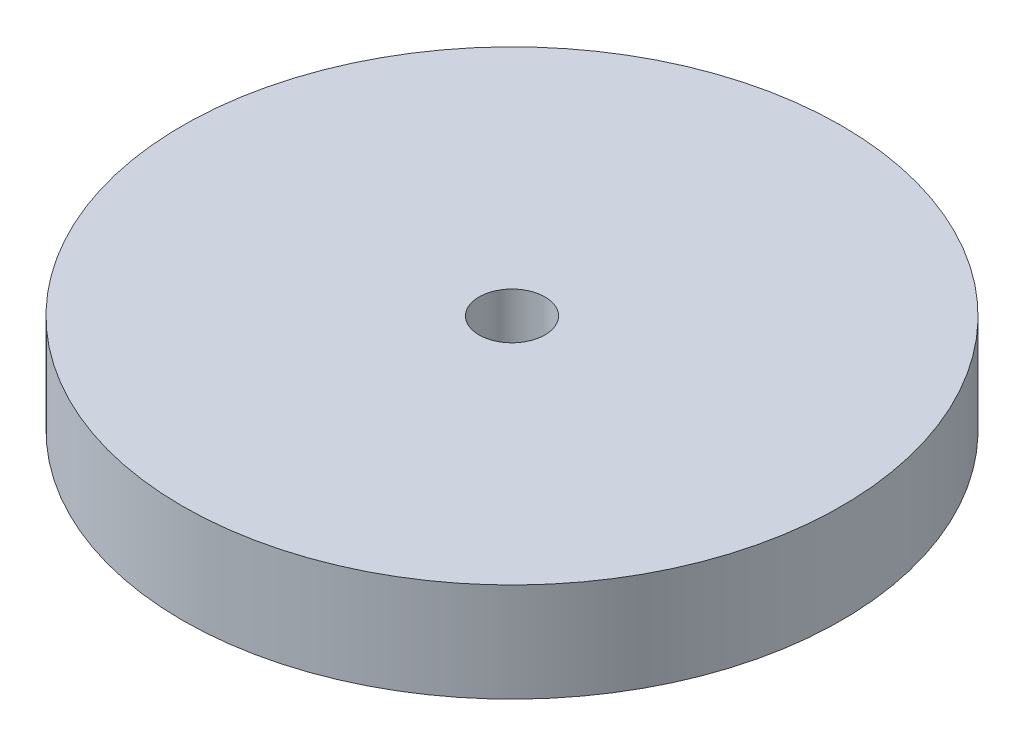
ISO-10303-21;
HEADER;
FILE_DESCRIPTION(('STEP AP214'),'2;1');
FILE_NAME('part.step','',(''),(''),'','','');
FILE_SCHEMA(('AUTOMOTIVE_DESIGN { 1 0 10303 214 1 1 1 1 }'));
ENDSEC;
DATA;
#1=APPLICATION_CONTEXT('core data for automotive mechanical design processes');
#2=APPLICATION_PROTOCOL_DEFINITION('international standard','automotive_design',2000,#1);
#3=PRODUCT_CONTEXT('',#1,'mechanical');
#4=PRODUCT('Part','Part','',(#3));
#5=PRODUCT_RELATED_PRODUCT_CATEGORY('part','',(#4));
#6=PRODUCT_DEFINITION_FORMATION('','',#4);
#7=PRODUCT_DEFINITION_CONTEXT('part definition',#1,'design');
#8=PRODUCT_DEFINITION('design','',#6,#7);
#9=PRODUCT_DEFINITION_SHAPE('','',#8);
#10=(LENGTH_UNIT() NAMED_UNIT(*) SI_UNIT(.MILLI.,.METRE.));
#11=(NAMED_UNIT(*) PLANE_ANGLE_UNIT() SI_UNIT($,.RADIAN.));
#12=(NAMED_UNIT(*) SI_UNIT($,.STERADIAN.) SOLID_ANGLE_UNIT());
#13=UNCERTAINTY_MEASURE_WITH_UNIT(LENGTH_MEASURE(1.E-05),#10,'distance_accuracy_value','');
#14=(GEOMETRIC_REPRESENTATION_CONTEXT(3) GLOBAL_UNCERTAINTY_ASSIGNED_CONTEXT((#13)) GLOBAL_UNIT_ASSIGNED_CONTEXT((#10,
#11,#12)) REPRESENTATION_CONTEXT('',''));
#15=CARTESIAN_POINT('',(0.,0.,0.));
#16=DIRECTION('',(0.,0.,1.));
#17=DIRECTION('',(1.,0.,0.));
#18=AXIS2_PLACEMENT_3D('',#15,#16,#17);
#19=CARTESIAN_POINT('',(0.,3.,0.));
#20=DIRECTION('',(0.,-1.,0.));
#21=DIRECTION('',(0.,0.,-1.));
#22=AXIS2_PLACEMENT_3D('',#19,#20,#21);
#23=CYLINDRICAL_SURFACE('',#22,10.);
#24=CARTESIAN_POINT('',(0.,3.,0.));
#25=DIRECTION('',(0.,1.,0.));
#26=DIRECTION('',(0.,0.,1.));
#27=AXIS2_PLACEMENT_3D('',#24,#25,#26);
#28=CIRCLE('',#27,10.);
#29=CARTESIAN_POINT('',(0.,3.,10.));
#30=VERTEX_POINT('',#29);
#31=EDGE_CURVE('E10',#30,#30,#28,.T.);
#32=ORIENTED_EDGE('',*,*,#31,.F.);
#33=EDGE_LOOP('',(#32));
#34=FACE_BOUND('',#33,.T.);
#35=CARTESIAN_POINT('',(0.,0.,0.));
#36=DIRECTION('',(0.,1.,0.));
#37=DIRECTION('',(0.,0.,1.));
#38=AXIS2_PLACEMENT_3D('',#35,#36,#37);
#39=CIRCLE('',#38,10.);
#40=CARTESIAN_POINT('',(0.,0.,10.));
#41=VERTEX_POINT('',#40);
#42=EDGE_CURVE('E38',#41,#41,#39,.T.);
#43=ORIENTED_EDGE('',*,*,#42,.T.);
#44=EDGE_LOOP('',(#43));
#45=FACE_BOUND('',#44,.T.);
#46=ADVANCED_FACE('F31',(#34,#45),#23,.T.);
#47=CARTESIAN_POINT('',(0.,3.,0.));
#48=DIRECTION('',(0.,1.,0.));
#49=DIRECTION('',(0.,0.,1.));
#50=AXIS2_PLACEMENT_3D('',#47,#48,#49);
#51=PLANE('',#50);
#52=CARTESIAN_POINT('',(0.,3.,0.));
#53=DIRECTION('',(0.,1.,0.));
#54=DIRECTION('',(0.,0.,1.));
#55=AXIS2_PLACEMENT_3D('',#52,#53,#54);
#56=CIRCLE('',#55,1.);
#57=CARTESIAN_POINT('',(0.,3.,1.));
#58=VERTEX_POINT('',#57);
#59=EDGE_CURVE('E44',#58,#58,#56,.T.);
#60=ORIENTED_EDGE('',*,*,#59,.F.);
#61=EDGE_LOOP('',(#60));
#62=FACE_BOUND('',#61,.T.);
#63=ORIENTED_EDGE('',*,*,#31,.T.);
#64=EDGE_LOOP('',(#63));
#65=FACE_BOUND('',#64,.T.);
#66=ADVANCED_FACE('F61',(#62,#65),#51,.T.);
#67=CARTESIAN_POINT('',(0.,0.,0.));
#68=DIRECTION('',(0.,1.,0.));
#69=DIRECTION('',(0.,0.,1.));
#70=AXIS2_PLACEMENT_3D('',#67,#68,#69);
#71=PLANE('',#70);
#72=CARTESIAN_POINT('',(0.,0.,0.));
#73=DIRECTION('',(0.,1.,0.));
#74=DIRECTION('',(0.,0.,1.));
#75=AXIS2_PLACEMENT_3D('',#72,#73,#74);
#76=CIRCLE('',#75,1.);
#77=CARTESIAN_POINT('',(0.,0.,1.));
#78=VERTEX_POINT('',#77);
#79=EDGE_CURVE('E34',#78,#78,#76,.T.);
#80=ORIENTED_EDGE('',*,*,#79,.T.);
#81=EDGE_LOOP('',(#80));
#82=FACE_BOUND('',#81,.T.);
#83=ORIENTED_EDGE('',*,*,#42,.F.);
#84=EDGE_LOOP('',(#83));
#85=FACE_BOUND('',#84,.T.);
#86=ADVANCED_FACE('F51',(#82,#85),#71,.F.);
#87=CARTESIAN_POINT('',(0.,-7.,0.));
#88=DIRECTION('',(0.,1.,0.));
#89=DIRECTION('',(0.,0.,1.));
#90=AXIS2_PLACEMENT_3D('',#87,#88,#89);
#91=CYLINDRICAL_SURFACE('',#90,1.);
#92=ORIENTED_EDGE('',*,*,#59,.T.);
#93=EDGE_LOOP('',(#92));
#94=FACE_BOUND('',#93,.T.);
#95=ORIENTED_EDGE('',*,*,#79,.F.);
#96=EDGE_LOOP('',(#95));
#97=FACE_BOUND('',#96,.T.);
#98=ADVANCED_FACE('F54',(#94,#97),#91,.F.);
#99=CLOSED_SHELL('',(#46,#66,#86,#98));
#100=MANIFOLD_SOLID_BREP('B2',#99);
#101=ADVANCED_BREP_SHAPE_REPRESENTATION('',(#18,#100),#14);
#102=SHAPE_DEFINITION_REPRESENTATION(#9,#101);
ENDSEC;
END-ISO-10303-21;
